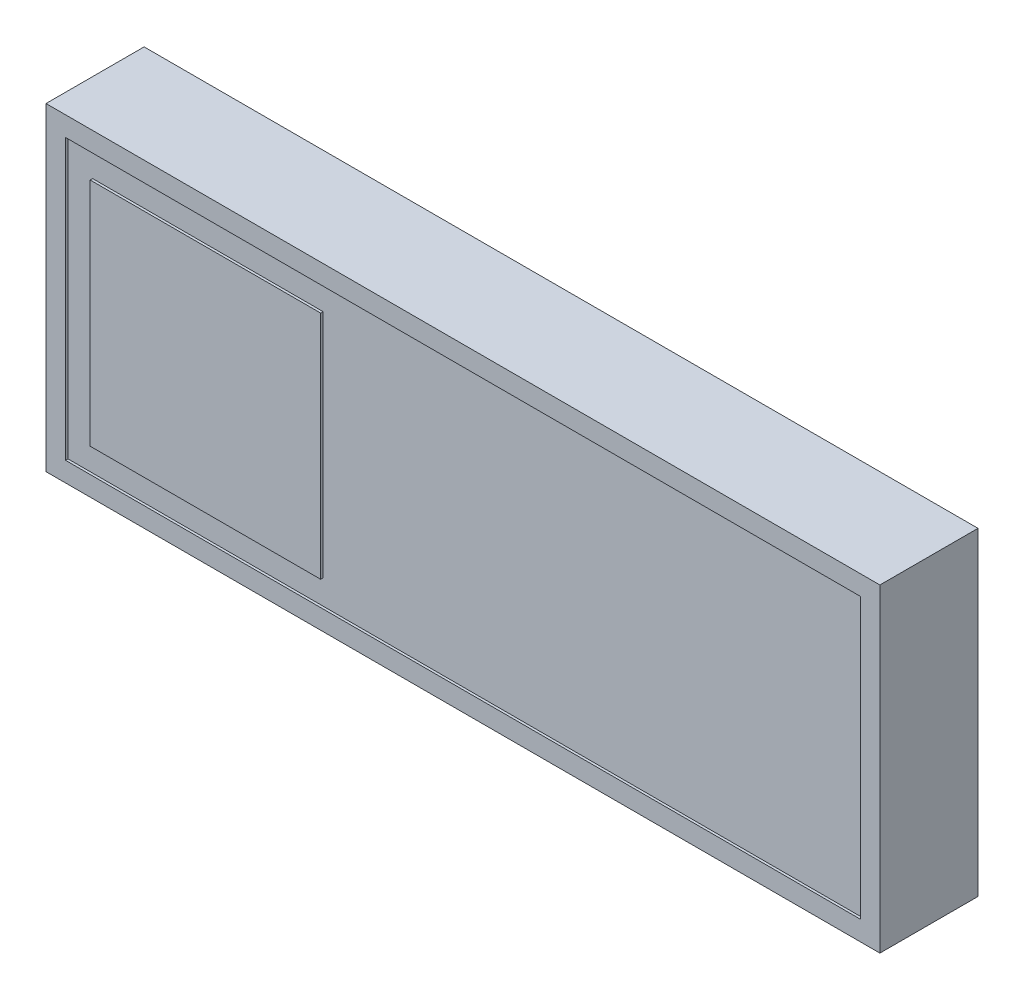
ISO-10303-21;
HEADER;
FILE_DESCRIPTION(('STEP AP214'),'2;1');
FILE_NAME('part.step','',(''),(''),'','','');
FILE_SCHEMA(('AUTOMOTIVE_DESIGN { 1 0 10303 214 1 1 1 1 }'));
ENDSEC;
DATA;
#1=APPLICATION_CONTEXT('core data for automotive mechanical design processes');
#2=APPLICATION_PROTOCOL_DEFINITION('international standard','automotive_design',2000,#1);
#3=PRODUCT_CONTEXT('',#1,'mechanical');
#4=PRODUCT('Part','Part','',(#3));
#5=PRODUCT_RELATED_PRODUCT_CATEGORY('part','',(#4));
#6=PRODUCT_DEFINITION_FORMATION('','',#4);
#7=PRODUCT_DEFINITION_CONTEXT('part definition',#1,'design');
#8=PRODUCT_DEFINITION('design','',#6,#7);
#9=PRODUCT_DEFINITION_SHAPE('','',#8);
#10=(LENGTH_UNIT() NAMED_UNIT(*) SI_UNIT(.MILLI.,.METRE.));
#11=(NAMED_UNIT(*) PLANE_ANGLE_UNIT() SI_UNIT($,.RADIAN.));
#12=(NAMED_UNIT(*) SI_UNIT($,.STERADIAN.) SOLID_ANGLE_UNIT());
#13=UNCERTAINTY_MEASURE_WITH_UNIT(LENGTH_MEASURE(1.E-05),#10,'distance_accuracy_value','');
#14=(GEOMETRIC_REPRESENTATION_CONTEXT(3) GLOBAL_UNCERTAINTY_ASSIGNED_CONTEXT((#13)) GLOBAL_UNIT_ASSIGNED_CONTEXT((#10,
#11,#12)) REPRESENTATION_CONTEXT('',''));
#15=CARTESIAN_POINT('',(0.,0.,0.));
#16=DIRECTION('',(0.,0.,1.));
#17=DIRECTION('',(1.,0.,0.));
#18=AXIS2_PLACEMENT_3D('',#15,#16,#17);
#19=CARTESIAN_POINT('',(48.619922455571,3.669924353304,0.4));
#20=DIRECTION('',(8.74227765734797E-08,-1.,0.));
#21=DIRECTION('',(0.,0.,-1.));
#22=AXIS2_PLACEMENT_3D('',#19,#20,#21);
#23=PLANE('',#22);
#24=CARTESIAN_POINT('',(47.679922455571,3.669924271126,0.4));
#25=DIRECTION('',(0.,0.,-1.));
#26=VECTOR('',#25,1.);
#27=LINE('',#24,#26);
#28=CARTESIAN_POINT('',(47.679922455571,3.66992427112629,0.4));
#29=VERTEX_POINT('',#28);
#30=CARTESIAN_POINT('',(47.679922455571,3.66992427112629,0.39));
#31=VERTEX_POINT('',#30);
#32=EDGE_CURVE('E245',#29,#31,#27,.T.);
#33=ORIENTED_EDGE('',*,*,#32,.F.);
#34=CARTESIAN_POINT('',(47.679922455571,3.66992427112659,0.4));
#35=DIRECTION('',(0.999999999999996,8.74227764279061E-08,0.));
#36=VECTOR('',#35,1.);
#37=LINE('',#34,#36);
#38=CARTESIAN_POINT('',(48.619922455571,3.669924353304,0.4));
#39=VERTEX_POINT('',#38);
#40=EDGE_CURVE('E164',#29,#39,#37,.T.);
#41=ORIENTED_EDGE('',*,*,#40,.T.);
#42=CARTESIAN_POINT('',(48.619922455571,3.669924353304,0.4));
#43=DIRECTION('',(0.,0.,-1.));
#44=VECTOR('',#43,1.);
#45=LINE('',#42,#44);
#46=CARTESIAN_POINT('',(48.619922455571,3.669924353304,0.39));
#47=VERTEX_POINT('',#46);
#48=EDGE_CURVE('E248',#39,#47,#45,.T.);
#49=ORIENTED_EDGE('',*,*,#48,.T.);
#50=CARTESIAN_POINT('',(47.679922455571,3.66992427112659,0.39));
#51=DIRECTION('',(0.999999999999996,8.74227764279067E-08,0.));
#52=VECTOR('',#51,1.);
#53=LINE('',#50,#52);
#54=EDGE_CURVE('E170',#31,#47,#53,.T.);
#55=ORIENTED_EDGE('',*,*,#54,.F.);
#56=EDGE_LOOP('',(#33,#41,#49,#55));
#57=FACE_BOUND('',#56,.T.);
#58=ADVANCED_FACE('F40',(#57),#23,.F.);
#59=CARTESIAN_POINT('',(48.619922455571,3.669924353304,0.4));
#60=DIRECTION('',(-1.,-8.74227765734797E-08,0.));
#61=DIRECTION('',(-8.74227765734797E-08,1.,0.));
#62=AXIS2_PLACEMENT_3D('',#59,#60,#61);
#63=PLANE('',#62);
#64=ORIENTED_EDGE('',*,*,#48,.F.);
#65=CARTESIAN_POINT('',(48.619922455571,3.669924353304,0.4));
#66=DIRECTION('',(8.74227773506316E-08,-0.999999999999996,0.));
#67=VECTOR('',#66,1.);
#68=LINE('',#65,#67);
#69=CARTESIAN_POINT('',(48.6199225377487,2.729924353304,0.4));
#70=VERTEX_POINT('',#69);
#71=EDGE_CURVE('E161',#39,#70,#68,.T.);
#72=ORIENTED_EDGE('',*,*,#71,.T.);
#73=CARTESIAN_POINT('',(48.6199225377484,2.729924353304,0.4));
#74=DIRECTION('',(0.,0.,-1.));
#75=VECTOR('',#74,1.);
#76=LINE('',#73,#75);
#77=CARTESIAN_POINT('',(48.6199225377487,2.729924353304,0.39));
#78=VERTEX_POINT('',#77);
#79=EDGE_CURVE('E141',#70,#78,#76,.T.);
#80=ORIENTED_EDGE('',*,*,#79,.T.);
#81=CARTESIAN_POINT('',(48.619922455571,3.669924353304,0.39));
#82=DIRECTION('',(8.74227773506316E-08,-0.999999999999996,0.));
#83=VECTOR('',#82,1.);
#84=LINE('',#81,#83);
#85=EDGE_CURVE('E157',#47,#78,#84,.T.);
#86=ORIENTED_EDGE('',*,*,#85,.F.);
#87=EDGE_LOOP('',(#64,#72,#80,#86));
#88=FACE_BOUND('',#87,.T.);
#89=ADVANCED_FACE('F156',(#88),#63,.F.);
#90=CARTESIAN_POINT('',(48.619922537749,2.729924353304,0.4));
#91=DIRECTION('',(-8.74227765734797E-08,1.,0.));
#92=DIRECTION('',(0.,0.,1.));
#93=AXIS2_PLACEMENT_3D('',#90,#91,#92);
#94=PLANE('',#93);
#95=ORIENTED_EDGE('',*,*,#79,.F.);
#96=CARTESIAN_POINT('',(48.619922537749,2.729924353304,0.4));
#97=DIRECTION('',(-0.999999999999996,-8.74227764279061E-08,0.));
#98=VECTOR('',#97,1.);
#99=LINE('',#96,#98);
#100=CARTESIAN_POINT('',(47.6799225377487,2.7299242711263,0.4));
#101=VERTEX_POINT('',#100);
#102=EDGE_CURVE('E268',#70,#101,#99,.T.);
#103=ORIENTED_EDGE('',*,*,#102,.T.);
#104=CARTESIAN_POINT('',(47.6799225377484,2.729924271126,0.39));
#105=DIRECTION('',(0.,0.,1.));
#106=VECTOR('',#105,1.);
#107=LINE('',#104,#106);
#108=CARTESIAN_POINT('',(47.6799225377487,2.7299242711263,0.39));
#109=VERTEX_POINT('',#108);
#110=EDGE_CURVE('E144',#109,#101,#107,.T.);
#111=ORIENTED_EDGE('',*,*,#110,.F.);
#112=CARTESIAN_POINT('',(48.619922537749,2.729924353304,0.39));
#113=DIRECTION('',(-0.999999999999996,-8.74227755051815E-08,0.));
#114=VECTOR('',#113,1.);
#115=LINE('',#112,#114);
#116=EDGE_CURVE('E136',#78,#109,#115,.T.);
#117=ORIENTED_EDGE('',*,*,#116,.F.);
#118=EDGE_LOOP('',(#95,#103,#111,#117));
#119=FACE_BOUND('',#118,.T.);
#120=ADVANCED_FACE('F139',(#119),#94,.F.);
#121=CARTESIAN_POINT('',(49.19992249666,3.199924404009,0.4));
#122=DIRECTION('',(0.,0.,-1.));
#123=DIRECTION('',(0.,-1.,0.));
#124=AXIS2_PLACEMENT_3D('',#121,#122,#123);
#125=PLANE('',#124);
#126=ORIENTED_EDGE('',*,*,#102,.F.);
#127=ORIENTED_EDGE('',*,*,#71,.F.);
#128=ORIENTED_EDGE('',*,*,#40,.F.);
#129=CARTESIAN_POINT('',(47.679922455571,3.669924271126,0.4));
#130=DIRECTION('',(8.74227773506316E-08,-0.999999999999996,0.));
#131=VECTOR('',#130,1.);
#132=LINE('',#129,#131);
#133=EDGE_CURVE('E150',#29,#101,#132,.T.);
#134=ORIENTED_EDGE('',*,*,#133,.T.);
#135=EDGE_LOOP('',(#126,#127,#128,#134));
#136=FACE_BOUND('',#135,.T.);
#137=ADVANCED_FACE('F626',(#136),#125,.F.);
#138=CARTESIAN_POINT('',(47.679922455571,3.669924271126,0.4));
#139=DIRECTION('',(1.,8.74227765734797E-08,0.));
#140=DIRECTION('',(0.,0.,-1.));
#141=AXIS2_PLACEMENT_3D('',#138,#139,#140);
#142=PLANE('',#141);
#143=ORIENTED_EDGE('',*,*,#110,.T.);
#144=ORIENTED_EDGE('',*,*,#133,.F.);
#145=ORIENTED_EDGE('',*,*,#32,.T.);
#146=CARTESIAN_POINT('',(47.6799225377484,2.729924271126,0.39));
#147=DIRECTION('',(-8.74227773506316E-08,0.999999999999996,0.));
#148=VECTOR('',#147,1.);
#149=LINE('',#146,#148);
#150=EDGE_CURVE('E129',#109,#31,#149,.T.);
#151=ORIENTED_EDGE('',*,*,#150,.F.);
#152=EDGE_LOOP('',(#143,#144,#145,#151));
#153=FACE_BOUND('',#152,.T.);
#154=ADVANCED_FACE('F193',(#153),#142,.F.);
#155=CARTESIAN_POINT('',(49.19992249666,3.199924404009,0.39));
#156=DIRECTION('',(0.,0.,1.));
#157=DIRECTION('',(1.,0.,0.));
#158=AXIS2_PLACEMENT_3D('',#155,#156,#157);
#159=PLANE('',#158);
#160=ORIENTED_EDGE('',*,*,#54,.T.);
#161=ORIENTED_EDGE('',*,*,#85,.T.);
#162=ORIENTED_EDGE('',*,*,#116,.T.);
#163=ORIENTED_EDGE('',*,*,#150,.T.);
#164=EDGE_LOOP('',(#160,#161,#162,#163));
#165=FACE_BOUND('',#164,.T.);
#166=CARTESIAN_POINT('',(47.579922446829,3.769924262384,0.39));
#167=DIRECTION('',(8.74227773506316E-08,-0.999999999999996,0.));
#168=VECTOR('',#167,1.);
#169=LINE('',#166,#168);
#170=CARTESIAN_POINT('',(47.579922446829,3.769924262384,0.39));
#171=VERTEX_POINT('',#170);
#172=CARTESIAN_POINT('',(47.579922546491,2.629924262384,0.39));
#173=VERTEX_POINT('',#172);
#174=EDGE_CURVE('E173',#171,#173,#169,.T.);
#175=ORIENTED_EDGE('',*,*,#174,.T.);
#176=CARTESIAN_POINT('',(47.579922546491,2.629924262384,0.39));
#177=DIRECTION('',(0.999999999999996,8.74227765475189E-08,0.));
#178=VECTOR('',#177,1.);
#179=LINE('',#176,#178);
#180=CARTESIAN_POINT('',(50.819922546491,2.6299245456339,0.39));
#181=VERTEX_POINT('',#180);
#182=EDGE_CURVE('E287',#173,#181,#179,.T.);
#183=ORIENTED_EDGE('',*,*,#182,.T.);
#184=CARTESIAN_POINT('',(50.819922546491,2.629924545634,0.39));
#185=DIRECTION('',(-8.74227773506316E-08,0.999999999999996,0.));
#186=VECTOR('',#185,1.);
#187=LINE('',#184,#186);
#188=CARTESIAN_POINT('',(50.819922446829,3.7699245456339,0.39));
#189=VERTEX_POINT('',#188);
#190=EDGE_CURVE('E295',#181,#189,#187,.T.);
#191=ORIENTED_EDGE('',*,*,#190,.T.);
#192=CARTESIAN_POINT('',(50.819922446829,3.7699245456338,0.39));
#193=DIRECTION('',(-0.999999999999996,-8.7422776413667E-08,0.));
#194=VECTOR('',#193,1.);
#195=LINE('',#192,#194);
#196=EDGE_CURVE('E303',#189,#171,#195,.T.);
#197=ORIENTED_EDGE('',*,*,#196,.T.);
#198=EDGE_LOOP('',(#175,#183,#191,#197));
#199=FACE_BOUND('',#198,.T.);
#200=ADVANCED_FACE('F168',(#165,#199),#159,.T.);
#201=CARTESIAN_POINT('',(47.579922446829,3.769924262384,0.39));
#202=DIRECTION('',(-1.,-8.74227765734797E-08,0.));
#203=DIRECTION('',(-8.74227765734797E-08,1.,0.));
#204=AXIS2_PLACEMENT_3D('',#201,#202,#203);
#205=PLANE('',#204);
#206=CARTESIAN_POINT('',(47.579922546491,2.629924262384,0.4));
#207=DIRECTION('',(0.,0.,-1.));
#208=VECTOR('',#207,1.);
#209=LINE('',#206,#208);
#210=CARTESIAN_POINT('',(47.579922546491,2.629924262384,0.4));
#211=VERTEX_POINT('',#210);
#212=EDGE_CURVE('E283',#211,#173,#209,.T.);
#213=ORIENTED_EDGE('',*,*,#212,.T.);
#214=ORIENTED_EDGE('',*,*,#174,.F.);
#215=CARTESIAN_POINT('',(47.579922446829,3.769924262384,0.39));
#216=DIRECTION('',(0.,0.,1.));
#217=VECTOR('',#216,1.);
#218=LINE('',#215,#217);
#219=CARTESIAN_POINT('',(47.579922446829,3.769924262384,0.4));
#220=VERTEX_POINT('',#219);
#221=EDGE_CURVE('E307',#171,#220,#218,.T.);
#222=ORIENTED_EDGE('',*,*,#221,.T.);
#223=CARTESIAN_POINT('',(47.579922446829,3.769924262384,0.4));
#224=DIRECTION('',(8.74227773506316E-08,-0.999999999999996,0.));
#225=VECTOR('',#224,1.);
#226=LINE('',#223,#225);
#227=EDGE_CURVE('E340',#220,#211,#226,.T.);
#228=ORIENTED_EDGE('',*,*,#227,.T.);
#229=EDGE_LOOP('',(#213,#214,#222,#228));
#230=FACE_BOUND('',#229,.T.);
#231=ADVANCED_FACE('F192',(#230),#205,.F.);
#232=CARTESIAN_POINT('',(47.579922546491,2.629924262384,0.39));
#233=DIRECTION('',(8.74227765734797E-08,-1.,0.));
#234=DIRECTION('',(0.,0.,-1.));
#235=AXIS2_PLACEMENT_3D('',#232,#233,#234);
#236=PLANE('',#235);
#237=CARTESIAN_POINT('',(50.819922546491,2.6299245456338,0.4));
#238=DIRECTION('',(0.,0.,-1.));
#239=VECTOR('',#238,1.);
#240=LINE('',#237,#239);
#241=CARTESIAN_POINT('',(50.819922546491,2.6299245456339,0.4));
#242=VERTEX_POINT('',#241);
#243=EDGE_CURVE('E291',#242,#181,#240,.T.);
#244=ORIENTED_EDGE('',*,*,#243,.T.);
#245=ORIENTED_EDGE('',*,*,#182,.F.);
#246=ORIENTED_EDGE('',*,*,#212,.F.);
#247=CARTESIAN_POINT('',(47.579922546491,2.629924262384,0.4));
#248=DIRECTION('',(0.999999999999996,8.74227765475189E-08,0.));
#249=VECTOR('',#248,1.);
#250=LINE('',#247,#249);
#251=EDGE_CURVE('E336',#211,#242,#250,.T.);
#252=ORIENTED_EDGE('',*,*,#251,.T.);
#253=EDGE_LOOP('',(#244,#245,#246,#252));
#254=FACE_BOUND('',#253,.T.);
#255=ADVANCED_FACE('F603',(#254),#236,.F.);
#256=CARTESIAN_POINT('',(50.819922446829,3.769924545634,0.39));
#257=DIRECTION('',(1.,8.74227765734797E-08,0.));
#258=DIRECTION('',(0.,0.,-1.));
#259=AXIS2_PLACEMENT_3D('',#256,#257,#258);
#260=PLANE('',#259);
#261=CARTESIAN_POINT('',(50.819922446829,3.769924545634,0.4));
#262=DIRECTION('',(0.,0.,-1.));
#263=VECTOR('',#262,1.);
#264=LINE('',#261,#263);
#265=CARTESIAN_POINT('',(50.819922446829,3.7699245456339,0.4));
#266=VERTEX_POINT('',#265);
#267=EDGE_CURVE('E299',#266,#189,#264,.T.);
#268=ORIENTED_EDGE('',*,*,#267,.T.);
#269=ORIENTED_EDGE('',*,*,#190,.F.);
#270=ORIENTED_EDGE('',*,*,#243,.F.);
#271=CARTESIAN_POINT('',(50.819922546491,2.629924545634,0.4));
#272=DIRECTION('',(-8.74227773506316E-08,0.999999999999996,0.));
#273=VECTOR('',#272,1.);
#274=LINE('',#271,#273);
#275=EDGE_CURVE('E327',#242,#266,#274,.T.);
#276=ORIENTED_EDGE('',*,*,#275,.T.);
#277=EDGE_LOOP('',(#268,#269,#270,#276));
#278=FACE_BOUND('',#277,.T.);
#279=ADVANCED_FACE('F594',(#278),#260,.F.);
#280=CARTESIAN_POINT('',(47.579922446829,3.769924262384,0.39));
#281=DIRECTION('',(-8.74227765734797E-08,1.,0.));
#282=DIRECTION('',(0.,0.,1.));
#283=AXIS2_PLACEMENT_3D('',#280,#281,#282);
#284=PLANE('',#283);
#285=ORIENTED_EDGE('',*,*,#221,.F.);
#286=ORIENTED_EDGE('',*,*,#196,.F.);
#287=ORIENTED_EDGE('',*,*,#267,.F.);
#288=CARTESIAN_POINT('',(50.819922446829,3.76992454563379,0.4));
#289=DIRECTION('',(-0.999999999999996,-8.74227765475189E-08,0.));
#290=VECTOR('',#289,1.);
#291=LINE('',#288,#290);
#292=EDGE_CURVE('E322',#266,#220,#291,.T.);
#293=ORIENTED_EDGE('',*,*,#292,.T.);
#294=EDGE_LOOP('',(#285,#286,#287,#293));
#295=FACE_BOUND('',#294,.T.);
#296=ADVANCED_FACE('F586',(#295),#284,.F.);
#297=CARTESIAN_POINT('',(50.899922439835,3.849924552628,0.4));
#298=DIRECTION('',(-1.,-8.74227765734797E-08,0.));
#299=DIRECTION('',(-8.74227765734797E-08,1.,0.));
#300=AXIS2_PLACEMENT_3D('',#297,#298,#299);
#301=PLANE('',#300);
#302=CARTESIAN_POINT('',(50.899922439835,3.849924552628,0.));
#303=DIRECTION('',(0.,0.,1.));
#304=VECTOR('',#303,1.);
#305=LINE('',#302,#304);
#306=CARTESIAN_POINT('',(50.899922439835,3.849924552628,0.));
#307=VERTEX_POINT('',#306);
#308=CARTESIAN_POINT('',(50.899922439835,3.849924552628,0.4));
#309=VERTEX_POINT('',#308);
#310=EDGE_CURVE('E355',#307,#309,#305,.T.);
#311=ORIENTED_EDGE('',*,*,#310,.T.);
#312=CARTESIAN_POINT('',(50.899922439835,3.849924552628,0.4));
#313=DIRECTION('',(8.74227773506316E-08,-0.999999999999996,0.));
#314=VECTOR('',#313,1.);
#315=LINE('',#312,#314);
#316=CARTESIAN_POINT('',(50.8999225534848,2.549924552628,0.4));
#317=VERTEX_POINT('',#316);
#318=EDGE_CURVE('E344',#309,#317,#315,.T.);
#319=ORIENTED_EDGE('',*,*,#318,.T.);
#320=CARTESIAN_POINT('',(50.8999225534846,2.549924552628,0.4));
#321=DIRECTION('',(0.,0.,-1.));
#322=VECTOR('',#321,1.);
#323=LINE('',#320,#322);
#324=CARTESIAN_POINT('',(50.8999225534848,2.549924552628,0.));
#325=VERTEX_POINT('',#324);
#326=EDGE_CURVE('E388',#317,#325,#323,.T.);
#327=ORIENTED_EDGE('',*,*,#326,.T.);
#328=CARTESIAN_POINT('',(50.899922439835,3.849924552628,0.));
#329=DIRECTION('',(8.74227773506316E-08,-0.999999999999996,0.));
#330=VECTOR('',#329,1.);
#331=LINE('',#328,#330);
#332=EDGE_CURVE('E376',#307,#325,#331,.T.);
#333=ORIENTED_EDGE('',*,*,#332,.F.);
#334=EDGE_LOOP('',(#311,#319,#327,#333));
#335=FACE_BOUND('',#334,.T.);
#336=ADVANCED_FACE('F579',(#335),#301,.F.);
#337=CARTESIAN_POINT('',(50.899922439835,3.849924552628,0.4));
#338=DIRECTION('',(8.74227765734797E-08,-1.,0.));
#339=DIRECTION('',(0.,0.,-1.));
#340=AXIS2_PLACEMENT_3D('',#337,#338,#339);
#341=PLANE('',#340);
#342=CARTESIAN_POINT('',(47.499922439835,3.84992425539056,0.));
#343=DIRECTION('',(0.,0.,1.));
#344=VECTOR('',#343,1.);
#345=LINE('',#342,#344);
#346=CARTESIAN_POINT('',(47.499922439835,3.84992425539028,0.));
#347=VERTEX_POINT('',#346);
#348=CARTESIAN_POINT('',(47.499922439835,3.84992425539028,0.4));
#349=VERTEX_POINT('',#348);
#350=EDGE_CURVE('E362',#347,#349,#345,.T.);
#351=ORIENTED_EDGE('',*,*,#350,.T.);
#352=CARTESIAN_POINT('',(47.499922439835,3.84992425539056,0.4));
#353=DIRECTION('',(0.999999999999996,8.74227765853125E-08,0.));
#354=VECTOR('',#353,1.);
#355=LINE('',#352,#354);
#356=EDGE_CURVE('E349',#349,#309,#355,.T.);
#357=ORIENTED_EDGE('',*,*,#356,.T.);
#358=ORIENTED_EDGE('',*,*,#310,.F.);
#359=CARTESIAN_POINT('',(47.499922439835,3.84992425539056,0.));
#360=DIRECTION('',(0.999999999999996,8.74227764577591E-08,0.));
#361=VECTOR('',#360,1.);
#362=LINE('',#359,#361);
#363=EDGE_CURVE('E382',#347,#307,#362,.T.);
#364=ORIENTED_EDGE('',*,*,#363,.F.);
#365=EDGE_LOOP('',(#351,#357,#358,#364));
#366=FACE_BOUND('',#365,.T.);
#367=ADVANCED_FACE('F571',(#366),#341,.F.);
#368=CARTESIAN_POINT('',(49.19992249666,3.199924404009,0.4));
#369=DIRECTION('',(0.,0.,-1.));
#370=DIRECTION('',(0.,-1.,0.));
#371=AXIS2_PLACEMENT_3D('',#368,#369,#370);
#372=PLANE('',#371);
#373=ORIENTED_EDGE('',*,*,#275,.F.);
#374=ORIENTED_EDGE('',*,*,#251,.F.);
#375=ORIENTED_EDGE('',*,*,#227,.F.);
#376=ORIENTED_EDGE('',*,*,#292,.F.);
#377=EDGE_LOOP('',(#373,#374,#375,#376));
#378=FACE_BOUND('',#377,.T.);
#379=CARTESIAN_POINT('',(47.499922553485,2.54992425539056,0.4));
#380=DIRECTION('',(0.999999999999996,8.74227764577593E-08,0.));
#381=VECTOR('',#380,1.);
#382=LINE('',#379,#381);
#383=CARTESIAN_POINT('',(47.4999225534848,2.54992425539028,0.4));
#384=VERTEX_POINT('',#383);
#385=EDGE_CURVE('E326',#384,#317,#382,.T.);
#386=ORIENTED_EDGE('',*,*,#385,.T.);
#387=ORIENTED_EDGE('',*,*,#318,.F.);
#388=ORIENTED_EDGE('',*,*,#356,.F.);
#389=CARTESIAN_POINT('',(47.499922439835,3.84992425539,0.4));
#390=DIRECTION('',(8.74227773506316E-08,-0.999999999999996,0.));
#391=VECTOR('',#390,1.);
#392=LINE('',#389,#391);
#393=EDGE_CURVE('E358',#349,#384,#392,.T.);
#394=ORIENTED_EDGE('',*,*,#393,.T.);
#395=EDGE_LOOP('',(#386,#387,#388,#394));
#396=FACE_BOUND('',#395,.T.);
#397=ADVANCED_FACE('F400',(#378,#396),#372,.F.);
#398=CARTESIAN_POINT('',(50.899922553485,2.549924552628,0.4));
#399=DIRECTION('',(-8.74227765734797E-08,1.,0.));
#400=DIRECTION('',(0.,0.,1.));
#401=AXIS2_PLACEMENT_3D('',#398,#399,#400);
#402=PLANE('',#401);
#403=ORIENTED_EDGE('',*,*,#326,.F.);
#404=ORIENTED_EDGE('',*,*,#385,.F.);
#405=CARTESIAN_POINT('',(47.499922553485,2.54992425539056,0.4));
#406=DIRECTION('',(0.,0.,-1.));
#407=VECTOR('',#406,1.);
#408=LINE('',#405,#407);
#409=CARTESIAN_POINT('',(47.4999225534848,2.54992425539028,0.));
#410=VERTEX_POINT('',#409);
#411=EDGE_CURVE('E52',#384,#410,#408,.T.);
#412=ORIENTED_EDGE('',*,*,#411,.T.);
#413=CARTESIAN_POINT('',(50.899922553485,2.549924552628,0.));
#414=DIRECTION('',(-0.999999999999996,-8.74227764577593E-08,0.));
#415=VECTOR('',#414,1.);
#416=LINE('',#413,#415);
#417=EDGE_CURVE('E370',#325,#410,#416,.T.);
#418=ORIENTED_EDGE('',*,*,#417,.F.);
#419=EDGE_LOOP('',(#403,#404,#412,#418));
#420=FACE_BOUND('',#419,.T.);
#421=ADVANCED_FACE('F409',(#420),#402,.F.);
#422=CARTESIAN_POINT('',(49.19992249666,3.199924404009,0.));
#423=DIRECTION('',(0.,0.,-1.));
#424=DIRECTION('',(0.,-1.,0.));
#425=AXIS2_PLACEMENT_3D('',#422,#423,#424);
#426=PLANE('',#425);
#427=ORIENTED_EDGE('',*,*,#332,.T.);
#428=ORIENTED_EDGE('',*,*,#417,.T.);
#429=CARTESIAN_POINT('',(47.4999225534846,2.54992425539,0.));
#430=DIRECTION('',(-8.74227773506316E-08,0.999999999999996,0.));
#431=VECTOR('',#430,1.);
#432=LINE('',#429,#431);
#433=EDGE_CURVE('E11',#410,#347,#432,.T.);
#434=ORIENTED_EDGE('',*,*,#433,.T.);
#435=ORIENTED_EDGE('',*,*,#363,.T.);
#436=EDGE_LOOP('',(#427,#428,#434,#435));
#437=FACE_BOUND('',#436,.T.);
#438=ADVANCED_FACE('F431',(#437),#426,.T.);
#439=CARTESIAN_POINT('',(47.499922439835,3.84992425539,0.4));
#440=DIRECTION('',(1.,8.74227765734797E-08,0.));
#441=DIRECTION('',(0.,0.,-1.));
#442=AXIS2_PLACEMENT_3D('',#439,#440,#441);
#443=PLANE('',#442);
#444=ORIENTED_EDGE('',*,*,#411,.F.);
#445=ORIENTED_EDGE('',*,*,#393,.F.);
#446=ORIENTED_EDGE('',*,*,#350,.F.);
#447=ORIENTED_EDGE('',*,*,#433,.F.);
#448=EDGE_LOOP('',(#444,#445,#446,#447));
#449=FACE_BOUND('',#448,.T.);
#450=ADVANCED_FACE('F470',(#449),#443,.F.);
#451=CLOSED_SHELL('',(#58,#89,#120,#137,#154,#200,#231,#255,#279,#296,#336,#367,#397,#421,#438,#450));
#452=MANIFOLD_SOLID_BREP('B2',#451);
#453=ADVANCED_BREP_SHAPE_REPRESENTATION('',(#18,#452),#14);
#454=SHAPE_DEFINITION_REPRESENTATION(#9,#453);
ENDSEC;
END-ISO-10303-21;
